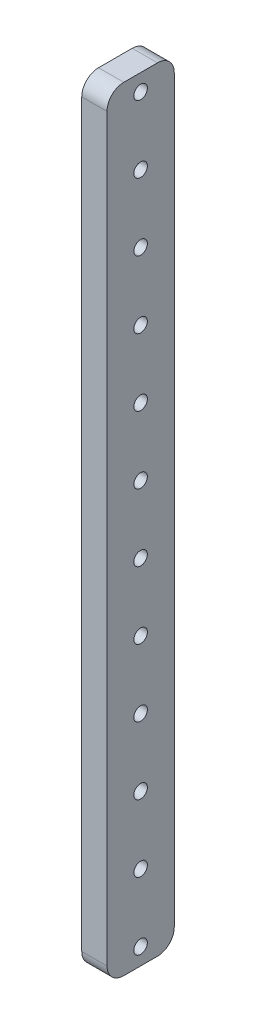
ISO-10303-21;
HEADER;
FILE_DESCRIPTION(('STEP AP214'),'2;1');
FILE_NAME('part.step','',(''),(''),'','','');
FILE_SCHEMA(('AUTOMOTIVE_DESIGN { 1 0 10303 214 1 1 1 1 }'));
ENDSEC;
DATA;
#1=APPLICATION_CONTEXT('core data for automotive mechanical design processes');
#2=APPLICATION_PROTOCOL_DEFINITION('international standard','automotive_design',2000,#1);
#3=PRODUCT_CONTEXT('',#1,'mechanical');
#4=PRODUCT('Part','Part','',(#3));
#5=PRODUCT_RELATED_PRODUCT_CATEGORY('part','',(#4));
#6=PRODUCT_DEFINITION_FORMATION('','',#4);
#7=PRODUCT_DEFINITION_CONTEXT('part definition',#1,'design');
#8=PRODUCT_DEFINITION('design','',#6,#7);
#9=PRODUCT_DEFINITION_SHAPE('','',#8);
#10=(LENGTH_UNIT() NAMED_UNIT(*) SI_UNIT(.MILLI.,.METRE.));
#11=(NAMED_UNIT(*) PLANE_ANGLE_UNIT() SI_UNIT($,.RADIAN.));
#12=(NAMED_UNIT(*) SI_UNIT($,.STERADIAN.) SOLID_ANGLE_UNIT());
#13=UNCERTAINTY_MEASURE_WITH_UNIT(LENGTH_MEASURE(1.E-05),#10,'distance_accuracy_value','');
#14=(GEOMETRIC_REPRESENTATION_CONTEXT(3) GLOBAL_UNCERTAINTY_ASSIGNED_CONTEXT((#13)) GLOBAL_UNIT_ASSIGNED_CONTEXT((#10,
#11,#12)) REPRESENTATION_CONTEXT('',''));
#15=CARTESIAN_POINT('',(0.,0.,0.));
#16=DIRECTION('',(0.,0.,1.));
#17=DIRECTION('',(1.,0.,0.));
#18=AXIS2_PLACEMENT_3D('',#15,#16,#17);
#19=CARTESIAN_POINT('',(333.375,-181.083337637632,478.09355990117));
#20=DIRECTION('',(1.,0.,0.));
#21=DIRECTION('',(0.,1.,0.));
#22=AXIS2_PLACEMENT_3D('',#19,#20,#21);
#23=PLANE('',#22);
#24=CARTESIAN_POINT('',(333.375,-317.5,742.95));
#25=DIRECTION('',(1.,0.,0.));
#26=DIRECTION('',(0.,1.,0.));
#27=AXIS2_PLACEMENT_3D('',#24,#25,#26);
#28=CIRCLE('',#27,2.5527);
#29=CARTESIAN_POINT('',(333.375,-314.9473,742.95));
#30=VERTEX_POINT('',#29);
#31=EDGE_CURVE('E87',#30,#30,#28,.T.);
#32=ORIENTED_EDGE('',*,*,#31,.F.);
#33=EDGE_LOOP('',(#32));
#34=FACE_BOUND('',#33,.T.);
#35=DIRECTION('',(0.,1.,0.));
#36=VECTOR('',#35,1.);
#37=CARTESIAN_POINT('',(333.375,-177.8,755.65));
#38=LINE('',#37,#36);
#39=CARTESIAN_POINT('',(333.375,-317.5,755.65));
#40=VERTEX_POINT('',#39);
#41=CARTESIAN_POINT('',(333.375,-38.1,755.65));
#42=VERTEX_POINT('',#41);
#43=EDGE_CURVE('E79',#40,#42,#38,.T.);
#44=ORIENTED_EDGE('',*,*,#43,.F.);
#45=CARTESIAN_POINT('',(333.375,-317.5,749.3));
#46=DIRECTION('',(1.,0.,0.));
#47=DIRECTION('',(0.,1.,0.));
#48=AXIS2_PLACEMENT_3D('',#45,#46,#47);
#49=CIRCLE('',#48,6.35);
#50=CARTESIAN_POINT('',(333.375,-323.85,749.3));
#51=VERTEX_POINT('',#50);
#52=EDGE_CURVE('E11',#40,#51,#49,.T.);
#53=ORIENTED_EDGE('',*,*,#52,.T.);
#54=DIRECTION('',(0.,0.,1.));
#55=VECTOR('',#54,1.);
#56=CARTESIAN_POINT('',(333.375,-323.85,742.95));
#57=LINE('',#56,#55);
#58=CARTESIAN_POINT('',(333.375,-323.85,736.6));
#59=VERTEX_POINT('',#58);
#60=EDGE_CURVE('E164',#59,#51,#57,.T.);
#61=ORIENTED_EDGE('',*,*,#60,.F.);
#62=CARTESIAN_POINT('',(333.375,-317.5,736.6));
#63=DIRECTION('',(1.,0.,0.));
#64=DIRECTION('',(0.,1.,0.));
#65=AXIS2_PLACEMENT_3D('',#62,#63,#64);
#66=CIRCLE('',#65,6.35);
#67=CARTESIAN_POINT('',(333.375,-317.5,730.25));
#68=VERTEX_POINT('',#67);
#69=EDGE_CURVE('E146',#59,#68,#66,.T.);
#70=ORIENTED_EDGE('',*,*,#69,.T.);
#71=DIRECTION('',(0.,1.,0.));
#72=VECTOR('',#71,1.);
#73=CARTESIAN_POINT('',(333.375,-177.8,730.25));
#74=LINE('',#73,#72);
#75=CARTESIAN_POINT('',(333.375,-38.1,730.25));
#76=VERTEX_POINT('',#75);
#77=EDGE_CURVE('E159',#68,#76,#74,.T.);
#78=ORIENTED_EDGE('',*,*,#77,.T.);
#79=CARTESIAN_POINT('',(333.375,-38.1,736.6));
#80=DIRECTION('',(1.,0.,0.));
#81=DIRECTION('',(0.,1.,0.));
#82=AXIS2_PLACEMENT_3D('',#79,#80,#81);
#83=CIRCLE('',#82,6.35);
#84=CARTESIAN_POINT('',(333.375,-31.75,736.6));
#85=VERTEX_POINT('',#84);
#86=EDGE_CURVE('E133',#76,#85,#83,.T.);
#87=ORIENTED_EDGE('',*,*,#86,.T.);
#88=DIRECTION('',(0.,0.,1.));
#89=VECTOR('',#88,1.);
#90=CARTESIAN_POINT('',(333.375,-31.75,742.95));
#91=LINE('',#90,#89);
#92=CARTESIAN_POINT('',(333.375,-31.75,749.3));
#93=VERTEX_POINT('',#92);
#94=EDGE_CURVE('E94',#85,#93,#91,.T.);
#95=ORIENTED_EDGE('',*,*,#94,.T.);
#96=CARTESIAN_POINT('',(333.375,-38.1,749.3));
#97=DIRECTION('',(1.,0.,0.));
#98=DIRECTION('',(0.,1.,0.));
#99=AXIS2_PLACEMENT_3D('',#96,#97,#98);
#100=CIRCLE('',#99,6.35);
#101=EDGE_CURVE('E91',#93,#42,#100,.T.);
#102=ORIENTED_EDGE('',*,*,#101,.T.);
#103=EDGE_LOOP('',(#44,#53,#61,#70,#78,#87,#95,#102));
#104=FACE_BOUND('',#103,.T.);
#105=CARTESIAN_POINT('',(333.375,-38.1,742.95));
#106=DIRECTION('',(1.,0.,0.));
#107=DIRECTION('',(0.,1.,0.));
#108=AXIS2_PLACEMENT_3D('',#105,#106,#107);
#109=CIRCLE('',#108,2.5527);
#110=CARTESIAN_POINT('',(333.375,-35.5473,742.95));
#111=VERTEX_POINT('',#110);
#112=EDGE_CURVE('E88',#111,#111,#109,.T.);
#113=ORIENTED_EDGE('',*,*,#112,.F.);
#114=EDGE_LOOP('',(#113));
#115=FACE_BOUND('',#114,.T.);
#116=CARTESIAN_POINT('',(333.375,-63.5,742.95));
#117=DIRECTION('',(1.,0.,0.));
#118=DIRECTION('',(0.,1.,0.));
#119=AXIS2_PLACEMENT_3D('',#116,#117,#118);
#120=CIRCLE('',#119,2.5527);
#121=CARTESIAN_POINT('',(333.375,-60.9473,742.95));
#122=VERTEX_POINT('',#121);
#123=EDGE_CURVE('E166',#122,#122,#120,.T.);
#124=ORIENTED_EDGE('',*,*,#123,.F.);
#125=EDGE_LOOP('',(#124));
#126=FACE_BOUND('',#125,.T.);
#127=CARTESIAN_POINT('',(333.375,-88.9,742.95));
#128=DIRECTION('',(1.,0.,0.));
#129=DIRECTION('',(0.,1.,0.));
#130=AXIS2_PLACEMENT_3D('',#127,#128,#129);
#131=CIRCLE('',#130,2.5527);
#132=CARTESIAN_POINT('',(333.375,-86.3473,742.95));
#133=VERTEX_POINT('',#132);
#134=EDGE_CURVE('E168',#133,#133,#131,.T.);
#135=ORIENTED_EDGE('',*,*,#134,.F.);
#136=EDGE_LOOP('',(#135));
#137=FACE_BOUND('',#136,.T.);
#138=CARTESIAN_POINT('',(333.375,-114.3,742.95));
#139=DIRECTION('',(1.,0.,0.));
#140=DIRECTION('',(0.,1.,0.));
#141=AXIS2_PLACEMENT_3D('',#138,#139,#140);
#142=CIRCLE('',#141,2.5527);
#143=CARTESIAN_POINT('',(333.375,-111.7473,742.95));
#144=VERTEX_POINT('',#143);
#145=EDGE_CURVE('E237',#144,#144,#142,.T.);
#146=ORIENTED_EDGE('',*,*,#145,.F.);
#147=EDGE_LOOP('',(#146));
#148=FACE_BOUND('',#147,.T.);
#149=CARTESIAN_POINT('',(333.375,-139.7,742.95));
#150=DIRECTION('',(1.,0.,0.));
#151=DIRECTION('',(0.,1.,0.));
#152=AXIS2_PLACEMENT_3D('',#149,#150,#151);
#153=CIRCLE('',#152,2.5527);
#154=CARTESIAN_POINT('',(333.375,-137.1473,742.95));
#155=VERTEX_POINT('',#154);
#156=EDGE_CURVE('E210',#155,#155,#153,.T.);
#157=ORIENTED_EDGE('',*,*,#156,.F.);
#158=EDGE_LOOP('',(#157));
#159=FACE_BOUND('',#158,.T.);
#160=CARTESIAN_POINT('',(333.375,-165.1,742.95));
#161=DIRECTION('',(1.,0.,0.));
#162=DIRECTION('',(0.,1.,0.));
#163=AXIS2_PLACEMENT_3D('',#160,#161,#162);
#164=CIRCLE('',#163,2.5527);
#165=CARTESIAN_POINT('',(333.375,-162.5473,742.95));
#166=VERTEX_POINT('',#165);
#167=EDGE_CURVE('E207',#166,#166,#164,.T.);
#168=ORIENTED_EDGE('',*,*,#167,.F.);
#169=EDGE_LOOP('',(#168));
#170=FACE_BOUND('',#169,.T.);
#171=CARTESIAN_POINT('',(333.375,-190.5,742.95));
#172=DIRECTION('',(1.,0.,0.));
#173=DIRECTION('',(0.,1.,0.));
#174=AXIS2_PLACEMENT_3D('',#171,#172,#173);
#175=CIRCLE('',#174,2.5527);
#176=CARTESIAN_POINT('',(333.375,-187.9473,742.95));
#177=VERTEX_POINT('',#176);
#178=EDGE_CURVE('E191',#177,#177,#175,.T.);
#179=ORIENTED_EDGE('',*,*,#178,.F.);
#180=EDGE_LOOP('',(#179));
#181=FACE_BOUND('',#180,.T.);
#182=CARTESIAN_POINT('',(333.375,-215.9,742.95));
#183=DIRECTION('',(1.,0.,0.));
#184=DIRECTION('',(0.,1.,0.));
#185=AXIS2_PLACEMENT_3D('',#182,#183,#184);
#186=CIRCLE('',#185,2.5527);
#187=CARTESIAN_POINT('',(333.375,-213.3473,742.95));
#188=VERTEX_POINT('',#187);
#189=EDGE_CURVE('E185',#188,#188,#186,.T.);
#190=ORIENTED_EDGE('',*,*,#189,.F.);
#191=EDGE_LOOP('',(#190));
#192=FACE_BOUND('',#191,.T.);
#193=CARTESIAN_POINT('',(333.375,-241.3,742.95));
#194=DIRECTION('',(1.,0.,0.));
#195=DIRECTION('',(0.,1.,0.));
#196=AXIS2_PLACEMENT_3D('',#193,#194,#195);
#197=CIRCLE('',#196,2.5527);
#198=CARTESIAN_POINT('',(333.375,-238.7473,742.95));
#199=VERTEX_POINT('',#198);
#200=EDGE_CURVE('E183',#199,#199,#197,.T.);
#201=ORIENTED_EDGE('',*,*,#200,.F.);
#202=EDGE_LOOP('',(#201));
#203=FACE_BOUND('',#202,.T.);
#204=CARTESIAN_POINT('',(333.375,-266.7,742.95));
#205=DIRECTION('',(1.,0.,0.));
#206=DIRECTION('',(0.,1.,0.));
#207=AXIS2_PLACEMENT_3D('',#204,#205,#206);
#208=CIRCLE('',#207,2.5527);
#209=CARTESIAN_POINT('',(333.375,-264.1473,742.95));
#210=VERTEX_POINT('',#209);
#211=EDGE_CURVE('E163',#210,#210,#208,.T.);
#212=ORIENTED_EDGE('',*,*,#211,.F.);
#213=EDGE_LOOP('',(#212));
#214=FACE_BOUND('',#213,.T.);
#215=CARTESIAN_POINT('',(333.375,-292.1,742.95));
#216=DIRECTION('',(1.,0.,0.));
#217=DIRECTION('',(0.,1.,0.));
#218=AXIS2_PLACEMENT_3D('',#215,#216,#217);
#219=CIRCLE('',#218,2.5527);
#220=CARTESIAN_POINT('',(333.375,-289.5473,742.95));
#221=VERTEX_POINT('',#220);
#222=EDGE_CURVE('E160',#221,#221,#219,.T.);
#223=ORIENTED_EDGE('',*,*,#222,.F.);
#224=EDGE_LOOP('',(#223));
#225=FACE_BOUND('',#224,.T.);
#226=ADVANCED_FACE('F17',(#34,#104,#115,#126,#137,#148,#159,#170,#181,#192,#203,#214,#225),#23,.T.);
#227=CARTESIAN_POINT('',(333.377,-177.8,730.25));
#228=DIRECTION('',(0.,0.,1.));
#229=DIRECTION('',(1.,0.,0.));
#230=AXIS2_PLACEMENT_3D('',#227,#228,#229);
#231=PLANE('',#230);
#232=ORIENTED_EDGE('',*,*,#77,.F.);
#233=DIRECTION('',(-1.,0.,0.));
#234=VECTOR('',#233,1.);
#235=CARTESIAN_POINT('',(323.85,-317.5,730.25));
#236=LINE('',#235,#234);
#237=CARTESIAN_POINT('',(323.85,-317.5,730.25));
#238=VERTEX_POINT('',#237);
#239=EDGE_CURVE('E136',#68,#238,#236,.T.);
#240=ORIENTED_EDGE('',*,*,#239,.T.);
#241=DIRECTION('',(0.,1.,0.));
#242=VECTOR('',#241,1.);
#243=CARTESIAN_POINT('',(323.85,-177.8,730.25));
#244=LINE('',#243,#242);
#245=CARTESIAN_POINT('',(323.85,-38.1,730.25));
#246=VERTEX_POINT('',#245);
#247=EDGE_CURVE('E115',#238,#246,#244,.T.);
#248=ORIENTED_EDGE('',*,*,#247,.T.);
#249=DIRECTION('',(-1.,0.,0.));
#250=VECTOR('',#249,1.);
#251=CARTESIAN_POINT('',(333.377,-38.1,730.25));
#252=LINE('',#251,#250);
#253=EDGE_CURVE('E129',#246,#76,#252,.F.);
#254=ORIENTED_EDGE('',*,*,#253,.T.);
#255=EDGE_LOOP('',(#232,#240,#248,#254));
#256=FACE_BOUND('',#255,.T.);
#257=ADVANCED_FACE('F252',(#256),#231,.F.);
#258=CARTESIAN_POINT('',(323.85,-147.208147538802,552.45));
#259=DIRECTION('',(1.,0.,0.));
#260=DIRECTION('',(0.,1.,0.));
#261=AXIS2_PLACEMENT_3D('',#258,#259,#260);
#262=PLANE('',#261);
#263=DIRECTION('',(0.,0.,1.));
#264=VECTOR('',#263,1.);
#265=CARTESIAN_POINT('',(323.85,-323.85,742.95));
#266=LINE('',#265,#264);
#267=CARTESIAN_POINT('',(323.85,-323.85,736.6));
#268=VERTEX_POINT('',#267);
#269=CARTESIAN_POINT('',(323.85,-323.85,749.3));
#270=VERTEX_POINT('',#269);
#271=EDGE_CURVE('E107',#268,#270,#266,.T.);
#272=ORIENTED_EDGE('',*,*,#271,.T.);
#273=CARTESIAN_POINT('',(323.85,-317.5,749.3));
#274=DIRECTION('',(1.,0.,0.));
#275=DIRECTION('',(0.,1.,0.));
#276=AXIS2_PLACEMENT_3D('',#273,#274,#275);
#277=CIRCLE('',#276,6.35);
#278=CARTESIAN_POINT('',(323.85,-317.5,755.65));
#279=VERTEX_POINT('',#278);
#280=EDGE_CURVE('E40',#270,#279,#277,.F.);
#281=ORIENTED_EDGE('',*,*,#280,.T.);
#282=DIRECTION('',(0.,1.,0.));
#283=VECTOR('',#282,1.);
#284=CARTESIAN_POINT('',(323.85,-177.8,755.65));
#285=LINE('',#284,#283);
#286=CARTESIAN_POINT('',(323.85,-38.1,755.65));
#287=VERTEX_POINT('',#286);
#288=EDGE_CURVE('E222',#279,#287,#285,.T.);
#289=ORIENTED_EDGE('',*,*,#288,.T.);
#290=CARTESIAN_POINT('',(323.85,-38.1,749.3));
#291=DIRECTION('',(1.,0.,0.));
#292=DIRECTION('',(0.,1.,0.));
#293=AXIS2_PLACEMENT_3D('',#290,#291,#292);
#294=CIRCLE('',#293,6.35);
#295=CARTESIAN_POINT('',(323.85,-31.75,749.3));
#296=VERTEX_POINT('',#295);
#297=EDGE_CURVE('E105',#287,#296,#294,.F.);
#298=ORIENTED_EDGE('',*,*,#297,.T.);
#299=DIRECTION('',(0.,0.,1.));
#300=VECTOR('',#299,1.);
#301=CARTESIAN_POINT('',(323.85,-31.75,742.95));
#302=LINE('',#301,#300);
#303=CARTESIAN_POINT('',(323.85,-31.75,736.6));
#304=VERTEX_POINT('',#303);
#305=EDGE_CURVE('E227',#304,#296,#302,.T.);
#306=ORIENTED_EDGE('',*,*,#305,.F.);
#307=CARTESIAN_POINT('',(323.85,-38.1,736.6));
#308=DIRECTION('',(1.,0.,0.));
#309=DIRECTION('',(0.,1.,0.));
#310=AXIS2_PLACEMENT_3D('',#307,#308,#309);
#311=CIRCLE('',#310,6.35);
#312=EDGE_CURVE('E125',#304,#246,#311,.F.);
#313=ORIENTED_EDGE('',*,*,#312,.T.);
#314=ORIENTED_EDGE('',*,*,#247,.F.);
#315=CARTESIAN_POINT('',(323.85,-317.5,736.6));
#316=DIRECTION('',(1.,0.,0.));
#317=DIRECTION('',(0.,1.,0.));
#318=AXIS2_PLACEMENT_3D('',#315,#316,#317);
#319=CIRCLE('',#318,6.35);
#320=EDGE_CURVE('E140',#238,#268,#319,.F.);
#321=ORIENTED_EDGE('',*,*,#320,.T.);
#322=EDGE_LOOP('',(#272,#281,#289,#298,#306,#313,#314,#321));
#323=FACE_BOUND('',#322,.T.);
#324=CARTESIAN_POINT('',(323.85,-38.1,742.95));
#325=DIRECTION('',(1.,0.,0.));
#326=DIRECTION('',(0.,1.,0.));
#327=AXIS2_PLACEMENT_3D('',#324,#325,#326);
#328=CIRCLE('',#327,2.5527);
#329=CARTESIAN_POINT('',(323.85,-35.5473,742.95));
#330=VERTEX_POINT('',#329);
#331=EDGE_CURVE('E218',#330,#330,#328,.T.);
#332=ORIENTED_EDGE('',*,*,#331,.T.);
#333=EDGE_LOOP('',(#332));
#334=FACE_BOUND('',#333,.T.);
#335=CARTESIAN_POINT('',(323.85,-63.5,742.95));
#336=DIRECTION('',(1.,0.,0.));
#337=DIRECTION('',(0.,1.,0.));
#338=AXIS2_PLACEMENT_3D('',#335,#336,#337);
#339=CIRCLE('',#338,2.5527);
#340=CARTESIAN_POINT('',(323.85,-60.9473,742.95));
#341=VERTEX_POINT('',#340);
#342=EDGE_CURVE('E216',#341,#341,#339,.T.);
#343=ORIENTED_EDGE('',*,*,#342,.T.);
#344=EDGE_LOOP('',(#343));
#345=FACE_BOUND('',#344,.T.);
#346=CARTESIAN_POINT('',(323.85,-88.9,742.95));
#347=DIRECTION('',(1.,0.,0.));
#348=DIRECTION('',(0.,1.,0.));
#349=AXIS2_PLACEMENT_3D('',#346,#347,#348);
#350=CIRCLE('',#349,2.5527);
#351=CARTESIAN_POINT('',(323.85,-86.3473,742.95));
#352=VERTEX_POINT('',#351);
#353=EDGE_CURVE('E219',#352,#352,#350,.T.);
#354=ORIENTED_EDGE('',*,*,#353,.T.);
#355=EDGE_LOOP('',(#354));
#356=FACE_BOUND('',#355,.T.);
#357=CARTESIAN_POINT('',(323.85,-114.3,742.95));
#358=DIRECTION('',(1.,0.,0.));
#359=DIRECTION('',(0.,1.,0.));
#360=AXIS2_PLACEMENT_3D('',#357,#358,#359);
#361=CIRCLE('',#360,2.5527);
#362=CARTESIAN_POINT('',(323.85,-111.7473,742.95));
#363=VERTEX_POINT('',#362);
#364=EDGE_CURVE('E180',#363,#363,#361,.T.);
#365=ORIENTED_EDGE('',*,*,#364,.T.);
#366=EDGE_LOOP('',(#365));
#367=FACE_BOUND('',#366,.T.);
#368=CARTESIAN_POINT('',(323.85,-139.7,742.95));
#369=DIRECTION('',(1.,0.,0.));
#370=DIRECTION('',(0.,1.,0.));
#371=AXIS2_PLACEMENT_3D('',#368,#369,#370);
#372=CIRCLE('',#371,2.5527);
#373=CARTESIAN_POINT('',(323.85,-137.1473,742.95));
#374=VERTEX_POINT('',#373);
#375=EDGE_CURVE('E177',#374,#374,#372,.T.);
#376=ORIENTED_EDGE('',*,*,#375,.T.);
#377=EDGE_LOOP('',(#376));
#378=FACE_BOUND('',#377,.T.);
#379=CARTESIAN_POINT('',(323.85,-165.1,742.95));
#380=DIRECTION('',(1.,0.,0.));
#381=DIRECTION('',(0.,1.,0.));
#382=AXIS2_PLACEMENT_3D('',#379,#380,#381);
#383=CIRCLE('',#382,2.5527);
#384=CARTESIAN_POINT('',(323.85,-162.5473,742.95));
#385=VERTEX_POINT('',#384);
#386=EDGE_CURVE('E181',#385,#385,#383,.T.);
#387=ORIENTED_EDGE('',*,*,#386,.T.);
#388=EDGE_LOOP('',(#387));
#389=FACE_BOUND('',#388,.T.);
#390=CARTESIAN_POINT('',(323.85,-190.5,742.95));
#391=DIRECTION('',(1.,0.,0.));
#392=DIRECTION('',(0.,1.,0.));
#393=AXIS2_PLACEMENT_3D('',#390,#391,#392);
#394=CIRCLE('',#393,2.5527);
#395=CARTESIAN_POINT('',(323.85,-187.9473,742.95));
#396=VERTEX_POINT('',#395);
#397=EDGE_CURVE('E174',#396,#396,#394,.T.);
#398=ORIENTED_EDGE('',*,*,#397,.T.);
#399=EDGE_LOOP('',(#398));
#400=FACE_BOUND('',#399,.T.);
#401=CARTESIAN_POINT('',(323.85,-215.9,742.95));
#402=DIRECTION('',(1.,0.,0.));
#403=DIRECTION('',(0.,1.,0.));
#404=AXIS2_PLACEMENT_3D('',#401,#402,#403);
#405=CIRCLE('',#404,2.5527);
#406=CARTESIAN_POINT('',(323.85,-213.3473,742.95));
#407=VERTEX_POINT('',#406);
#408=EDGE_CURVE('E171',#407,#407,#405,.T.);
#409=ORIENTED_EDGE('',*,*,#408,.T.);
#410=EDGE_LOOP('',(#409));
#411=FACE_BOUND('',#410,.T.);
#412=CARTESIAN_POINT('',(323.85,-241.3,742.95));
#413=DIRECTION('',(1.,0.,0.));
#414=DIRECTION('',(0.,1.,0.));
#415=AXIS2_PLACEMENT_3D('',#412,#413,#414);
#416=CIRCLE('',#415,2.5527);
#417=CARTESIAN_POINT('',(323.85,-238.7473,742.95));
#418=VERTEX_POINT('',#417);
#419=EDGE_CURVE('E175',#418,#418,#416,.T.);
#420=ORIENTED_EDGE('',*,*,#419,.T.);
#421=EDGE_LOOP('',(#420));
#422=FACE_BOUND('',#421,.T.);
#423=CARTESIAN_POINT('',(323.85,-266.7,742.95));
#424=DIRECTION('',(1.,0.,0.));
#425=DIRECTION('',(0.,1.,0.));
#426=AXIS2_PLACEMENT_3D('',#423,#424,#425);
#427=CIRCLE('',#426,2.5527);
#428=CARTESIAN_POINT('',(323.85,-264.1473,742.95));
#429=VERTEX_POINT('',#428);
#430=EDGE_CURVE('E213',#429,#429,#427,.T.);
#431=ORIENTED_EDGE('',*,*,#430,.T.);
#432=EDGE_LOOP('',(#431));
#433=FACE_BOUND('',#432,.T.);
#434=CARTESIAN_POINT('',(323.85,-292.1,742.95));
#435=DIRECTION('',(1.,0.,0.));
#436=DIRECTION('',(0.,1.,0.));
#437=AXIS2_PLACEMENT_3D('',#434,#435,#436);
#438=CIRCLE('',#437,2.5527);
#439=CARTESIAN_POINT('',(323.85,-289.5473,742.95));
#440=VERTEX_POINT('',#439);
#441=EDGE_CURVE('E308',#440,#440,#438,.T.);
#442=ORIENTED_EDGE('',*,*,#441,.T.);
#443=EDGE_LOOP('',(#442));
#444=FACE_BOUND('',#443,.T.);
#445=CARTESIAN_POINT('',(323.85,-317.5,742.95));
#446=DIRECTION('',(1.,0.,0.));
#447=DIRECTION('',(0.,1.,0.));
#448=AXIS2_PLACEMENT_3D('',#445,#446,#447);
#449=CIRCLE('',#448,2.5527);
#450=CARTESIAN_POINT('',(323.85,-314.9473,742.95));
#451=VERTEX_POINT('',#450);
#452=EDGE_CURVE('E304',#451,#451,#449,.T.);
#453=ORIENTED_EDGE('',*,*,#452,.T.);
#454=EDGE_LOOP('',(#453));
#455=FACE_BOUND('',#454,.T.);
#456=ADVANCED_FACE('F279',(#323,#334,#345,#356,#367,#378,#389,#400,#411,#422,#433,#444,#455),
#262,.F.);
#457=CARTESIAN_POINT('',(333.377,-317.5,742.95));
#458=DIRECTION('',(-1.,0.,0.));
#459=DIRECTION('',(0.,-1.,0.));
#460=AXIS2_PLACEMENT_3D('',#457,#458,#459);
#461=CYLINDRICAL_SURFACE('',#460,2.5527);
#462=ORIENTED_EDGE('',*,*,#452,.F.);
#463=EDGE_LOOP('',(#462));
#464=FACE_BOUND('',#463,.T.);
#465=ORIENTED_EDGE('',*,*,#31,.T.);
#466=EDGE_LOOP('',(#465));
#467=FACE_BOUND('',#466,.T.);
#468=ADVANCED_FACE('F284',(#464,#467),#461,.F.);
#469=CARTESIAN_POINT('',(333.377,-31.75,742.95));
#470=DIRECTION('',(0.,-1.,0.));
#471=DIRECTION('',(1.,0.,0.));
#472=AXIS2_PLACEMENT_3D('',#469,#470,#471);
#473=PLANE('',#472);
#474=ORIENTED_EDGE('',*,*,#94,.F.);
#475=DIRECTION('',(-1.,0.,0.));
#476=VECTOR('',#475,1.);
#477=CARTESIAN_POINT('',(333.377,-31.75,736.6));
#478=LINE('',#477,#476);
#479=EDGE_CURVE('E99',#85,#304,#478,.T.);
#480=ORIENTED_EDGE('',*,*,#479,.T.);
#481=ORIENTED_EDGE('',*,*,#305,.T.);
#482=DIRECTION('',(-1.,0.,0.));
#483=VECTOR('',#482,1.);
#484=CARTESIAN_POINT('',(333.375,-31.75,749.3));
#485=LINE('',#484,#483);
#486=EDGE_CURVE('E100',#296,#93,#485,.F.);
#487=ORIENTED_EDGE('',*,*,#486,.T.);
#488=EDGE_LOOP('',(#474,#480,#481,#487));
#489=FACE_BOUND('',#488,.T.);
#490=ADVANCED_FACE('F288',(#489),#473,.F.);
#491=CARTESIAN_POINT('',(333.377,-323.85,742.95));
#492=DIRECTION('',(0.,-1.,0.));
#493=DIRECTION('',(1.,0.,0.));
#494=AXIS2_PLACEMENT_3D('',#491,#492,#493);
#495=PLANE('',#494);
#496=ORIENTED_EDGE('',*,*,#60,.T.);
#497=DIRECTION('',(-1.,0.,0.));
#498=VECTOR('',#497,1.);
#499=CARTESIAN_POINT('',(333.377,-323.85,749.3));
#500=LINE('',#499,#498);
#501=EDGE_CURVE('E149',#51,#270,#500,.T.);
#502=ORIENTED_EDGE('',*,*,#501,.T.);
#503=ORIENTED_EDGE('',*,*,#271,.F.);
#504=DIRECTION('',(-1.,0.,0.));
#505=VECTOR('',#504,1.);
#506=CARTESIAN_POINT('',(333.375,-323.85,736.6));
#507=LINE('',#506,#505);
#508=EDGE_CURVE('E143',#268,#59,#507,.F.);
#509=ORIENTED_EDGE('',*,*,#508,.T.);
#510=EDGE_LOOP('',(#496,#502,#503,#509));
#511=FACE_BOUND('',#510,.T.);
#512=ADVANCED_FACE('F287',(#511),#495,.T.);
#513=CARTESIAN_POINT('',(333.377,-177.8,755.65));
#514=DIRECTION('',(0.,0.,1.));
#515=DIRECTION('',(1.,0.,0.));
#516=AXIS2_PLACEMENT_3D('',#513,#514,#515);
#517=PLANE('',#516);
#518=ORIENTED_EDGE('',*,*,#288,.F.);
#519=DIRECTION('',(-1.,0.,0.));
#520=VECTOR('',#519,1.);
#521=CARTESIAN_POINT('',(333.377,-317.5,755.65));
#522=LINE('',#521,#520);
#523=EDGE_CURVE('E26',#279,#40,#522,.F.);
#524=ORIENTED_EDGE('',*,*,#523,.T.);
#525=ORIENTED_EDGE('',*,*,#43,.T.);
#526=DIRECTION('',(-1.,0.,0.));
#527=VECTOR('',#526,1.);
#528=CARTESIAN_POINT('',(323.85,-38.1,755.65));
#529=LINE('',#528,#527);
#530=EDGE_CURVE('E83',#42,#287,#529,.T.);
#531=ORIENTED_EDGE('',*,*,#530,.T.);
#532=EDGE_LOOP('',(#518,#524,#525,#531));
#533=FACE_BOUND('',#532,.T.);
#534=ADVANCED_FACE('F81',(#533),#517,.T.);
#535=CARTESIAN_POINT('',(333.377,-38.1,742.95));
#536=DIRECTION('',(-1.,0.,0.));
#537=DIRECTION('',(0.,-1.,0.));
#538=AXIS2_PLACEMENT_3D('',#535,#536,#537);
#539=CYLINDRICAL_SURFACE('',#538,2.5527);
#540=ORIENTED_EDGE('',*,*,#331,.F.);
#541=EDGE_LOOP('',(#540));
#542=FACE_BOUND('',#541,.T.);
#543=ORIENTED_EDGE('',*,*,#112,.T.);
#544=EDGE_LOOP('',(#543));
#545=FACE_BOUND('',#544,.T.);
#546=ADVANCED_FACE('F345',(#542,#545),#539,.F.);
#547=CARTESIAN_POINT('',(333.377,-63.5,742.95));
#548=DIRECTION('',(-1.,0.,0.));
#549=DIRECTION('',(0.,-1.,0.));
#550=AXIS2_PLACEMENT_3D('',#547,#548,#549);
#551=CYLINDRICAL_SURFACE('',#550,2.5527);
#552=ORIENTED_EDGE('',*,*,#342,.F.);
#553=EDGE_LOOP('',(#552));
#554=FACE_BOUND('',#553,.T.);
#555=ORIENTED_EDGE('',*,*,#123,.T.);
#556=EDGE_LOOP('',(#555));
#557=FACE_BOUND('',#556,.T.);
#558=ADVANCED_FACE('F348',(#554,#557),#551,.F.);
#559=CARTESIAN_POINT('',(333.377,-88.9,742.95));
#560=DIRECTION('',(-1.,0.,0.));
#561=DIRECTION('',(0.,-1.,0.));
#562=AXIS2_PLACEMENT_3D('',#559,#560,#561);
#563=CYLINDRICAL_SURFACE('',#562,2.5527);
#564=ORIENTED_EDGE('',*,*,#353,.F.);
#565=EDGE_LOOP('',(#564));
#566=FACE_BOUND('',#565,.T.);
#567=ORIENTED_EDGE('',*,*,#134,.T.);
#568=EDGE_LOOP('',(#567));
#569=FACE_BOUND('',#568,.T.);
#570=ADVANCED_FACE('F352',(#566,#569),#563,.F.);
#571=CARTESIAN_POINT('',(333.377,-114.3,742.95));
#572=DIRECTION('',(-1.,0.,0.));
#573=DIRECTION('',(0.,-1.,0.));
#574=AXIS2_PLACEMENT_3D('',#571,#572,#573);
#575=CYLINDRICAL_SURFACE('',#574,2.5527);
#576=ORIENTED_EDGE('',*,*,#364,.F.);
#577=EDGE_LOOP('',(#576));
#578=FACE_BOUND('',#577,.T.);
#579=ORIENTED_EDGE('',*,*,#145,.T.);
#580=EDGE_LOOP('',(#579));
#581=FACE_BOUND('',#580,.T.);
#582=ADVANCED_FACE('F356',(#578,#581),#575,.F.);
#583=CARTESIAN_POINT('',(333.377,-139.7,742.95));
#584=DIRECTION('',(-1.,0.,0.));
#585=DIRECTION('',(0.,-1.,0.));
#586=AXIS2_PLACEMENT_3D('',#583,#584,#585);
#587=CYLINDRICAL_SURFACE('',#586,2.5527);
#588=ORIENTED_EDGE('',*,*,#375,.F.);
#589=EDGE_LOOP('',(#588));
#590=FACE_BOUND('',#589,.T.);
#591=ORIENTED_EDGE('',*,*,#156,.T.);
#592=EDGE_LOOP('',(#591));
#593=FACE_BOUND('',#592,.T.);
#594=ADVANCED_FACE('F360',(#590,#593),#587,.F.);
#595=CARTESIAN_POINT('',(333.377,-165.1,742.95));
#596=DIRECTION('',(-1.,0.,0.));
#597=DIRECTION('',(0.,-1.,0.));
#598=AXIS2_PLACEMENT_3D('',#595,#596,#597);
#599=CYLINDRICAL_SURFACE('',#598,2.5527);
#600=ORIENTED_EDGE('',*,*,#386,.F.);
#601=EDGE_LOOP('',(#600));
#602=FACE_BOUND('',#601,.T.);
#603=ORIENTED_EDGE('',*,*,#167,.T.);
#604=EDGE_LOOP('',(#603));
#605=FACE_BOUND('',#604,.T.);
#606=ADVANCED_FACE('F364',(#602,#605),#599,.F.);
#607=CARTESIAN_POINT('',(333.377,-190.5,742.95));
#608=DIRECTION('',(-1.,0.,0.));
#609=DIRECTION('',(0.,-1.,0.));
#610=AXIS2_PLACEMENT_3D('',#607,#608,#609);
#611=CYLINDRICAL_SURFACE('',#610,2.5527);
#612=ORIENTED_EDGE('',*,*,#397,.F.);
#613=EDGE_LOOP('',(#612));
#614=FACE_BOUND('',#613,.T.);
#615=ORIENTED_EDGE('',*,*,#178,.T.);
#616=EDGE_LOOP('',(#615));
#617=FACE_BOUND('',#616,.T.);
#618=ADVANCED_FACE('F248',(#614,#617),#611,.F.);
#619=CARTESIAN_POINT('',(333.377,-215.9,742.95));
#620=DIRECTION('',(-1.,0.,0.));
#621=DIRECTION('',(0.,-1.,0.));
#622=AXIS2_PLACEMENT_3D('',#619,#620,#621);
#623=CYLINDRICAL_SURFACE('',#622,2.5527);
#624=ORIENTED_EDGE('',*,*,#408,.F.);
#625=EDGE_LOOP('',(#624));
#626=FACE_BOUND('',#625,.T.);
#627=ORIENTED_EDGE('',*,*,#189,.T.);
#628=EDGE_LOOP('',(#627));
#629=FACE_BOUND('',#628,.T.);
#630=ADVANCED_FACE('F371',(#626,#629),#623,.F.);
#631=CARTESIAN_POINT('',(333.377,-241.3,742.95));
#632=DIRECTION('',(-1.,0.,0.));
#633=DIRECTION('',(0.,-1.,0.));
#634=AXIS2_PLACEMENT_3D('',#631,#632,#633);
#635=CYLINDRICAL_SURFACE('',#634,2.5527);
#636=ORIENTED_EDGE('',*,*,#419,.F.);
#637=EDGE_LOOP('',(#636));
#638=FACE_BOUND('',#637,.T.);
#639=ORIENTED_EDGE('',*,*,#200,.T.);
#640=EDGE_LOOP('',(#639));
#641=FACE_BOUND('',#640,.T.);
#642=ADVANCED_FACE('F273',(#638,#641),#635,.F.);
#643=CARTESIAN_POINT('',(333.377,-266.7,742.95));
#644=DIRECTION('',(-1.,0.,0.));
#645=DIRECTION('',(0.,-1.,0.));
#646=AXIS2_PLACEMENT_3D('',#643,#644,#645);
#647=CYLINDRICAL_SURFACE('',#646,2.5527);
#648=ORIENTED_EDGE('',*,*,#430,.F.);
#649=EDGE_LOOP('',(#648));
#650=FACE_BOUND('',#649,.T.);
#651=ORIENTED_EDGE('',*,*,#211,.T.);
#652=EDGE_LOOP('',(#651));
#653=FACE_BOUND('',#652,.T.);
#654=ADVANCED_FACE('F264',(#650,#653),#647,.F.);
#655=CARTESIAN_POINT('',(333.377,-292.1,742.95));
#656=DIRECTION('',(-1.,0.,0.));
#657=DIRECTION('',(0.,-1.,0.));
#658=AXIS2_PLACEMENT_3D('',#655,#656,#657);
#659=CYLINDRICAL_SURFACE('',#658,2.5527);
#660=ORIENTED_EDGE('',*,*,#441,.F.);
#661=EDGE_LOOP('',(#660));
#662=FACE_BOUND('',#661,.T.);
#663=ORIENTED_EDGE('',*,*,#222,.T.);
#664=EDGE_LOOP('',(#663));
#665=FACE_BOUND('',#664,.T.);
#666=ADVANCED_FACE('F255',(#662,#665),#659,.F.);
#667=CARTESIAN_POINT('',(333.377,-38.1,749.3));
#668=DIRECTION('',(1.,0.,0.));
#669=DIRECTION('',(0.,1.,0.));
#670=AXIS2_PLACEMENT_3D('',#667,#668,#669);
#671=CYLINDRICAL_SURFACE('',#670,6.35);
#672=ORIENTED_EDGE('',*,*,#101,.F.);
#673=ORIENTED_EDGE('',*,*,#486,.F.);
#674=ORIENTED_EDGE('',*,*,#297,.F.);
#675=ORIENTED_EDGE('',*,*,#530,.F.);
#676=EDGE_LOOP('',(#672,#673,#674,#675));
#677=FACE_BOUND('',#676,.T.);
#678=ADVANCED_FACE('F103',(#677),#671,.T.);
#679=CARTESIAN_POINT('',(333.377,-38.1,736.6));
#680=DIRECTION('',(-1.,0.,0.));
#681=DIRECTION('',(0.,-1.,0.));
#682=AXIS2_PLACEMENT_3D('',#679,#680,#681);
#683=CYLINDRICAL_SURFACE('',#682,6.35);
#684=ORIENTED_EDGE('',*,*,#86,.F.);
#685=ORIENTED_EDGE('',*,*,#253,.F.);
#686=ORIENTED_EDGE('',*,*,#312,.F.);
#687=ORIENTED_EDGE('',*,*,#479,.F.);
#688=EDGE_LOOP('',(#684,#685,#686,#687));
#689=FACE_BOUND('',#688,.T.);
#690=ADVANCED_FACE('F271',(#689),#683,.T.);
#691=CARTESIAN_POINT('',(333.377,-317.5,736.6));
#692=DIRECTION('',(1.,0.,0.));
#693=DIRECTION('',(0.,1.,0.));
#694=AXIS2_PLACEMENT_3D('',#691,#692,#693);
#695=CYLINDRICAL_SURFACE('',#694,6.35);
#696=ORIENTED_EDGE('',*,*,#69,.F.);
#697=ORIENTED_EDGE('',*,*,#508,.F.);
#698=ORIENTED_EDGE('',*,*,#320,.F.);
#699=ORIENTED_EDGE('',*,*,#239,.F.);
#700=EDGE_LOOP('',(#696,#697,#698,#699));
#701=FACE_BOUND('',#700,.T.);
#702=ADVANCED_FACE('F330',(#701),#695,.T.);
#703=CARTESIAN_POINT('',(333.377,-317.5,749.3));
#704=DIRECTION('',(-1.,0.,0.));
#705=DIRECTION('',(0.,-1.,0.));
#706=AXIS2_PLACEMENT_3D('',#703,#704,#705);
#707=CYLINDRICAL_SURFACE('',#706,6.35);
#708=ORIENTED_EDGE('',*,*,#52,.F.);
#709=ORIENTED_EDGE('',*,*,#523,.F.);
#710=ORIENTED_EDGE('',*,*,#280,.F.);
#711=ORIENTED_EDGE('',*,*,#501,.F.);
#712=EDGE_LOOP('',(#708,#709,#710,#711));
#713=FACE_BOUND('',#712,.T.);
#714=ADVANCED_FACE('F19',(#713),#707,.T.);
#715=CLOSED_SHELL('',(#226,#257,#456,#468,#490,#512,#534,#546,#558,#570,#582,#594,#606,#618,
#630,#642,#654,#666,#678,#690,#702,#714));
#716=MANIFOLD_SOLID_BREP('B1',#715);
#717=ADVANCED_BREP_SHAPE_REPRESENTATION('',(#18,#716),#14);
#718=SHAPE_DEFINITION_REPRESENTATION(#9,#717);
ENDSEC;
END-ISO-10303-21;
